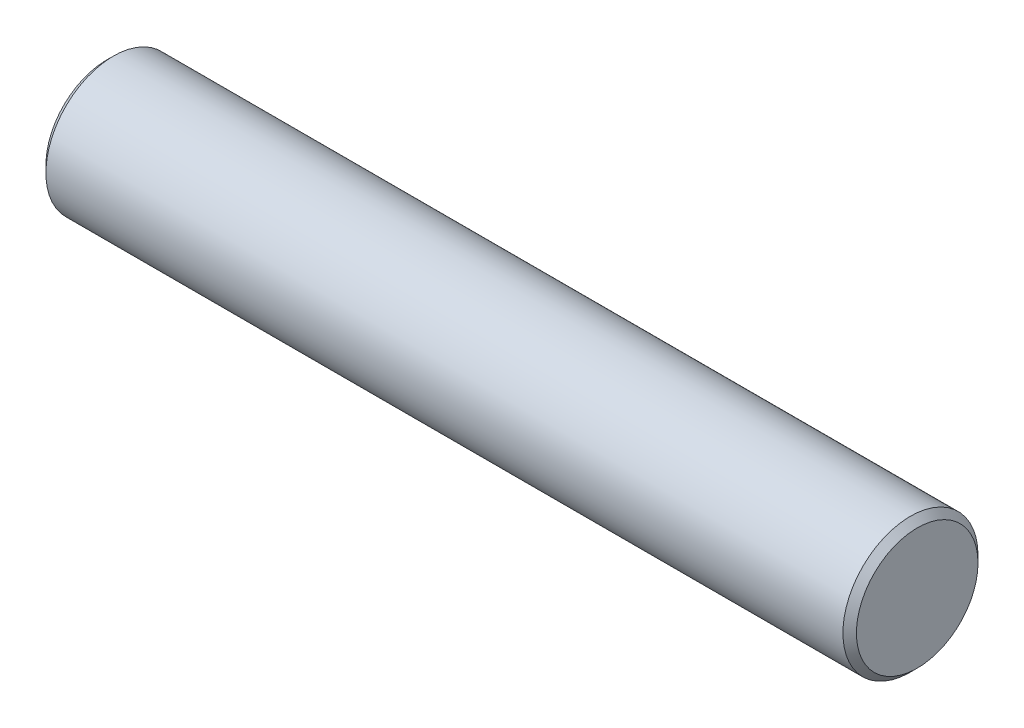
ISO-10303-21;
HEADER;
FILE_DESCRIPTION(('STEP AP214'),'2;1');
FILE_NAME('part.step','',(''),(''),'','','');
FILE_SCHEMA(('AUTOMOTIVE_DESIGN { 1 0 10303 214 1 1 1 1 }'));
ENDSEC;
DATA;
#1=APPLICATION_CONTEXT('core data for automotive mechanical design processes');
#2=APPLICATION_PROTOCOL_DEFINITION('international standard','automotive_design',2000,#1);
#3=PRODUCT_CONTEXT('',#1,'mechanical');
#4=PRODUCT('Part','Part','',(#3));
#5=PRODUCT_RELATED_PRODUCT_CATEGORY('part','',(#4));
#6=PRODUCT_DEFINITION_FORMATION('','',#4);
#7=PRODUCT_DEFINITION_CONTEXT('part definition',#1,'design');
#8=PRODUCT_DEFINITION('design','',#6,#7);
#9=PRODUCT_DEFINITION_SHAPE('','',#8);
#10=(LENGTH_UNIT() NAMED_UNIT(*) SI_UNIT(.MILLI.,.METRE.));
#11=(NAMED_UNIT(*) PLANE_ANGLE_UNIT() SI_UNIT($,.RADIAN.));
#12=(NAMED_UNIT(*) SI_UNIT($,.STERADIAN.) SOLID_ANGLE_UNIT());
#13=UNCERTAINTY_MEASURE_WITH_UNIT(LENGTH_MEASURE(1.E-05),#10,'distance_accuracy_value','');
#14=(GEOMETRIC_REPRESENTATION_CONTEXT(3) GLOBAL_UNCERTAINTY_ASSIGNED_CONTEXT((#13)) GLOBAL_UNIT_ASSIGNED_CONTEXT((#10,
#11,#12)) REPRESENTATION_CONTEXT('',''));
#15=CARTESIAN_POINT('',(0.,0.,0.));
#16=DIRECTION('',(0.,0.,1.));
#17=DIRECTION('',(1.,0.,0.));
#18=AXIS2_PLACEMENT_3D('',#15,#16,#17);
#19=CARTESIAN_POINT('',(12.,0.,0.));
#20=DIRECTION('',(-1.,0.,0.));
#21=DIRECTION('',(0.,0.,1.));
#22=AXIS2_PLACEMENT_3D('',#19,#20,#21);
#23=CYLINDRICAL_SURFACE('',#22,1.);
#24=CARTESIAN_POINT('',(0.0999999999999994,0.,0.));
#25=DIRECTION('',(1.,0.,0.));
#26=DIRECTION('',(0.,0.,-1.));
#27=AXIS2_PLACEMENT_3D('',#24,#25,#26);
#28=CIRCLE('',#27,1.);
#29=CARTESIAN_POINT('',(0.0999999999999994,0.,-1.));
#30=VERTEX_POINT('',#29);
#31=EDGE_CURVE('E45',#30,#30,#28,.T.);
#32=ORIENTED_EDGE('',*,*,#31,.T.);
#33=EDGE_LOOP('',(#32));
#34=FACE_BOUND('',#33,.T.);
#35=CARTESIAN_POINT('',(11.9,0.,0.));
#36=DIRECTION('',(1.,0.,0.));
#37=DIRECTION('',(0.,0.,-1.));
#38=AXIS2_PLACEMENT_3D('',#35,#36,#37);
#39=CIRCLE('',#38,1.);
#40=CARTESIAN_POINT('',(11.9,0.,-1.));
#41=VERTEX_POINT('',#40);
#42=EDGE_CURVE('E49',#41,#41,#39,.F.);
#43=ORIENTED_EDGE('',*,*,#42,.T.);
#44=EDGE_LOOP('',(#43));
#45=FACE_BOUND('',#44,.T.);
#46=ADVANCED_FACE('F33',(#34,#45),#23,.T.);
#47=CARTESIAN_POINT('',(12.,0.,0.));
#48=DIRECTION('',(1.,0.,0.));
#49=DIRECTION('',(0.,0.,-1.));
#50=AXIS2_PLACEMENT_3D('',#47,#48,#49);
#51=PLANE('',#50);
#52=CARTESIAN_POINT('',(12.,0.,0.));
#53=DIRECTION('',(1.,0.,0.));
#54=DIRECTION('',(0.,0.,-1.));
#55=AXIS2_PLACEMENT_3D('',#52,#53,#54);
#56=CIRCLE('',#55,0.9);
#57=CARTESIAN_POINT('',(12.,0.,-0.9));
#58=VERTEX_POINT('',#57);
#59=EDGE_CURVE('E10',#58,#58,#56,.T.);
#60=ORIENTED_EDGE('',*,*,#59,.T.);
#61=EDGE_LOOP('',(#60));
#62=FACE_BOUND('',#61,.T.);
#63=ADVANCED_FACE('F65',(#62),#51,.T.);
#64=CARTESIAN_POINT('',(0.,0.,0.));
#65=DIRECTION('',(1.,0.,0.));
#66=DIRECTION('',(0.,0.,-1.));
#67=AXIS2_PLACEMENT_3D('',#64,#65,#66);
#68=PLANE('',#67);
#69=CARTESIAN_POINT('',(0.,0.,0.));
#70=DIRECTION('',(1.,0.,0.));
#71=DIRECTION('',(0.,0.,-1.));
#72=AXIS2_PLACEMENT_3D('',#69,#70,#71);
#73=CIRCLE('',#72,0.900000000000003);
#74=CARTESIAN_POINT('',(0.,0.,-0.900000000000003));
#75=VERTEX_POINT('',#74);
#76=EDGE_CURVE('E41',#75,#75,#73,.F.);
#77=ORIENTED_EDGE('',*,*,#76,.T.);
#78=EDGE_LOOP('',(#77));
#79=FACE_BOUND('',#78,.T.);
#80=ADVANCED_FACE('F62',(#79),#68,.F.);
#81=CARTESIAN_POINT('',(0.0999999999999994,0.,0.));
#82=DIRECTION('',(1.,0.,0.));
#83=DIRECTION('',(0.,0.,-1.));
#84=AXIS2_PLACEMENT_3D('',#81,#82,#83);
#85=CONICAL_SURFACE('',#84,1.,0.785398163397435);
#86=ORIENTED_EDGE('',*,*,#76,.F.);
#87=EDGE_LOOP('',(#86));
#88=FACE_BOUND('',#87,.T.);
#89=ORIENTED_EDGE('',*,*,#31,.F.);
#90=EDGE_LOOP('',(#89));
#91=FACE_BOUND('',#90,.T.);
#92=ADVANCED_FACE('F58',(#88,#91),#85,.T.);
#93=CARTESIAN_POINT('',(12.,0.,0.));
#94=DIRECTION('',(-1.,0.,0.));
#95=DIRECTION('',(0.,0.,1.));
#96=AXIS2_PLACEMENT_3D('',#93,#94,#95);
#97=CONICAL_SURFACE('',#96,0.9,0.785398163397435);
#98=ORIENTED_EDGE('',*,*,#42,.F.);
#99=EDGE_LOOP('',(#98));
#100=FACE_BOUND('',#99,.T.);
#101=ORIENTED_EDGE('',*,*,#59,.F.);
#102=EDGE_LOOP('',(#101));
#103=FACE_BOUND('',#102,.T.);
#104=ADVANCED_FACE('F36',(#100,#103),#97,.T.);
#105=CLOSED_SHELL('',(#46,#63,#80,#92,#104));
#106=MANIFOLD_SOLID_BREP('B2',#105);
#107=ADVANCED_BREP_SHAPE_REPRESENTATION('',(#18,#106),#14);
#108=SHAPE_DEFINITION_REPRESENTATION(#9,#107);
ENDSEC;
END-ISO-10303-21;
